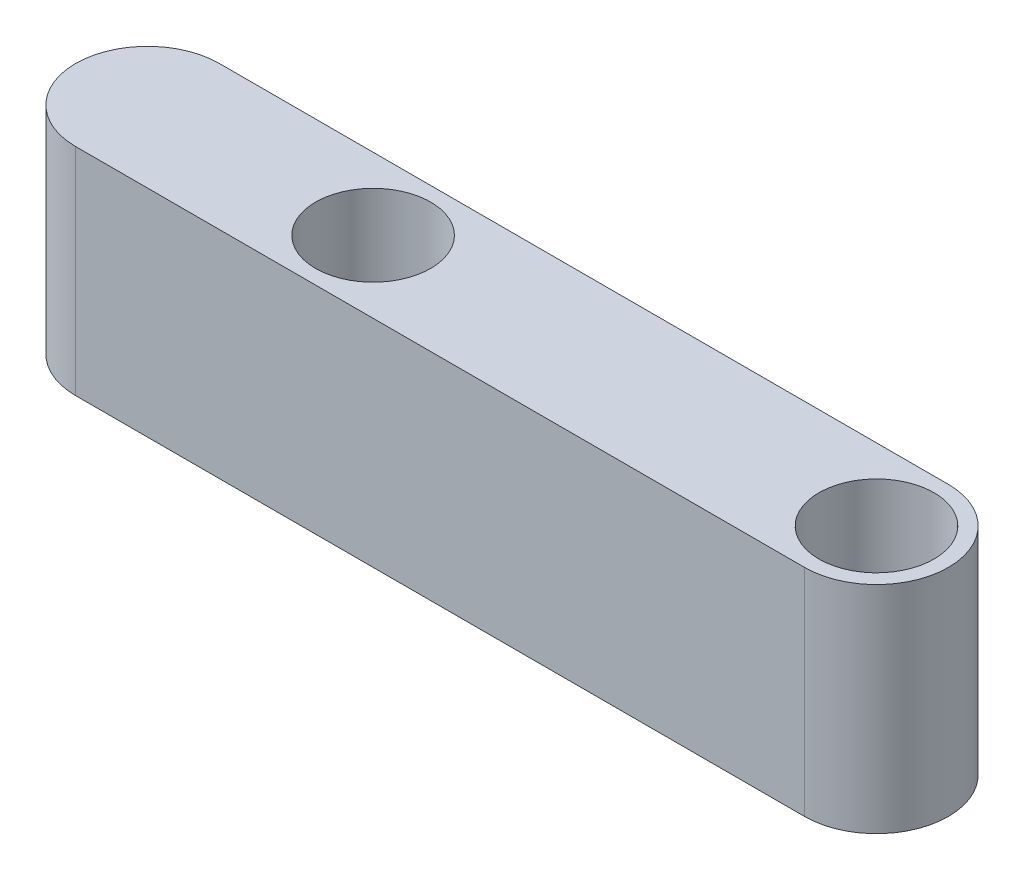
ISO-10303-21;
HEADER;
FILE_DESCRIPTION(('STEP AP214'),'2;1');
FILE_NAME('part.step','',(''),(''),'','','');
FILE_SCHEMA(('AUTOMOTIVE_DESIGN { 1 0 10303 214 1 1 1 1 }'));
ENDSEC;
DATA;
#1=APPLICATION_CONTEXT('core data for automotive mechanical design processes');
#2=APPLICATION_PROTOCOL_DEFINITION('international standard','automotive_design',2000,#1);
#3=PRODUCT_CONTEXT('',#1,'mechanical');
#4=PRODUCT('Part','Part','',(#3));
#5=PRODUCT_RELATED_PRODUCT_CATEGORY('part','',(#4));
#6=PRODUCT_DEFINITION_FORMATION('','',#4);
#7=PRODUCT_DEFINITION_CONTEXT('part definition',#1,'design');
#8=PRODUCT_DEFINITION('design','',#6,#7);
#9=PRODUCT_DEFINITION_SHAPE('','',#8);
#10=(LENGTH_UNIT() NAMED_UNIT(*) SI_UNIT(.MILLI.,.METRE.));
#11=(NAMED_UNIT(*) PLANE_ANGLE_UNIT() SI_UNIT($,.RADIAN.));
#12=(NAMED_UNIT(*) SI_UNIT($,.STERADIAN.) SOLID_ANGLE_UNIT());
#13=UNCERTAINTY_MEASURE_WITH_UNIT(LENGTH_MEASURE(1.E-05),#10,'distance_accuracy_value','');
#14=(GEOMETRIC_REPRESENTATION_CONTEXT(3) GLOBAL_UNCERTAINTY_ASSIGNED_CONTEXT((#13)) GLOBAL_UNIT_ASSIGNED_CONTEXT((#10,
#11,#12)) REPRESENTATION_CONTEXT('',''));
#15=CARTESIAN_POINT('',(0.,0.,0.));
#16=DIRECTION('',(0.,0.,1.));
#17=DIRECTION('',(1.,0.,0.));
#18=AXIS2_PLACEMENT_3D('',#15,#16,#17);
#19=CARTESIAN_POINT('',(0.,1.5,-31.7620802999206));
#20=DIRECTION('',(0.,0.,-1.));
#21=DIRECTION('',(-1.,0.,0.));
#22=AXIS2_PLACEMENT_3D('',#19,#20,#21);
#23=PLANE('',#22);
#24=DIRECTION('',(1.,0.,0.));
#25=VECTOR('',#24,1.);
#26=CARTESIAN_POINT('',(0.,0.,-31.7620802999206));
#27=LINE('',#26,#25);
#28=CARTESIAN_POINT('',(-48.5303285700837,0.,-31.7620802999206));
#29=VERTEX_POINT('',#28);
#30=CARTESIAN_POINT('',(-43.4616429647675,0.,-31.7620802999206));
#31=VERTEX_POINT('',#30);
#32=EDGE_CURVE('E110',#29,#31,#27,.T.);
#33=ORIENTED_EDGE('',*,*,#32,.T.);
#34=DIRECTION('',(0.,-1.,0.));
#35=VECTOR('',#34,1.);
#36=CARTESIAN_POINT('',(-43.4616429647675,1.5,-31.7620802999206));
#37=LINE('',#36,#35);
#38=CARTESIAN_POINT('',(-43.4616429647675,1.5,-31.7620802999206));
#39=VERTEX_POINT('',#38);
#40=EDGE_CURVE('E12',#39,#31,#37,.T.);
#41=ORIENTED_EDGE('',*,*,#40,.F.);
#42=DIRECTION('',(1.,0.,0.));
#43=VECTOR('',#42,1.);
#44=CARTESIAN_POINT('',(0.,1.5,-31.7620802999206));
#45=LINE('',#44,#43);
#46=CARTESIAN_POINT('',(-48.5303285700837,1.5,-31.7620802999206));
#47=VERTEX_POINT('',#46);
#48=EDGE_CURVE('E123',#47,#39,#45,.T.);
#49=ORIENTED_EDGE('',*,*,#48,.F.);
#50=DIRECTION('',(0.,-1.,0.));
#51=VECTOR('',#50,1.);
#52=CARTESIAN_POINT('',(-48.5303285700837,1.5,-31.7620802999206));
#53=LINE('',#52,#51);
#54=EDGE_CURVE('E122',#47,#29,#53,.T.);
#55=ORIENTED_EDGE('',*,*,#54,.T.);
#56=EDGE_LOOP('',(#33,#41,#49,#55));
#57=FACE_BOUND('',#56,.T.);
#58=ADVANCED_FACE('F65',(#57),#23,.F.);
#59=CARTESIAN_POINT('',(-43.4616429647675,1.5,-32.2620802999206));
#60=DIRECTION('',(0.,-1.,0.));
#61=DIRECTION('',(0.,0.,-1.));
#62=AXIS2_PLACEMENT_3D('',#59,#60,#61);
#63=CYLINDRICAL_SURFACE('',#62,0.5);
#64=CARTESIAN_POINT('',(-43.4616429647675,0.,-32.2620802999206));
#65=DIRECTION('',(0.,1.,0.));
#66=DIRECTION('',(0.,0.,1.));
#67=AXIS2_PLACEMENT_3D('',#64,#65,#66);
#68=CIRCLE('',#67,0.5);
#69=CARTESIAN_POINT('',(-43.4616429647675,0.,-32.7620802999206));
#70=VERTEX_POINT('',#69);
#71=EDGE_CURVE('E116',#31,#70,#68,.T.);
#72=ORIENTED_EDGE('',*,*,#71,.T.);
#73=DIRECTION('',(0.,-1.,0.));
#74=VECTOR('',#73,1.);
#75=CARTESIAN_POINT('',(-43.4616429647675,1.5,-32.7620802999206));
#76=LINE('',#75,#74);
#77=CARTESIAN_POINT('',(-43.4616429647675,1.5,-32.7620802999206));
#78=VERTEX_POINT('',#77);
#79=EDGE_CURVE('E76',#78,#70,#76,.T.);
#80=ORIENTED_EDGE('',*,*,#79,.F.);
#81=CARTESIAN_POINT('',(-43.4616429647675,1.5,-32.2620802999206));
#82=DIRECTION('',(0.,1.,0.));
#83=DIRECTION('',(0.,0.,1.));
#84=AXIS2_PLACEMENT_3D('',#81,#82,#83);
#85=CIRCLE('',#84,0.5);
#86=EDGE_CURVE('E85',#39,#78,#85,.T.);
#87=ORIENTED_EDGE('',*,*,#86,.F.);
#88=ORIENTED_EDGE('',*,*,#40,.T.);
#89=EDGE_LOOP('',(#72,#80,#87,#88));
#90=FACE_BOUND('',#89,.T.);
#91=ADVANCED_FACE('F177',(#90),#63,.T.);
#92=CARTESIAN_POINT('',(0.,1.5,-32.7620802999206));
#93=DIRECTION('',(0.,0.,-1.));
#94=DIRECTION('',(-1.,0.,0.));
#95=AXIS2_PLACEMENT_3D('',#92,#93,#94);
#96=PLANE('',#95);
#97=DIRECTION('',(1.,0.,0.));
#98=VECTOR('',#97,1.);
#99=CARTESIAN_POINT('',(0.,0.,-32.7620802999206));
#100=LINE('',#99,#98);
#101=CARTESIAN_POINT('',(-48.5303285700837,0.,-32.7620802999206));
#102=VERTEX_POINT('',#101);
#103=EDGE_CURVE('E104',#102,#70,#100,.T.);
#104=ORIENTED_EDGE('',*,*,#103,.F.);
#105=DIRECTION('',(0.,-1.,0.));
#106=VECTOR('',#105,1.);
#107=CARTESIAN_POINT('',(-48.5303285700837,1.5,-32.7620802999206));
#108=LINE('',#107,#106);
#109=CARTESIAN_POINT('',(-48.5303285700837,1.5,-32.7620802999206));
#110=VERTEX_POINT('',#109);
#111=EDGE_CURVE('E69',#110,#102,#108,.T.);
#112=ORIENTED_EDGE('',*,*,#111,.F.);
#113=DIRECTION('',(1.,0.,0.));
#114=VECTOR('',#113,1.);
#115=CARTESIAN_POINT('',(0.,1.5,-32.7620802999206));
#116=LINE('',#115,#114);
#117=EDGE_CURVE('E153',#110,#78,#116,.T.);
#118=ORIENTED_EDGE('',*,*,#117,.T.);
#119=ORIENTED_EDGE('',*,*,#79,.T.);
#120=EDGE_LOOP('',(#104,#112,#118,#119));
#121=FACE_BOUND('',#120,.T.);
#122=ADVANCED_FACE('F173',(#121),#96,.T.);
#123=CARTESIAN_POINT('',(-43.4616429647675,1.5,-32.2620802999206));
#124=DIRECTION('',(0.,-1.,0.));
#125=DIRECTION('',(0.,0.,-1.));
#126=AXIS2_PLACEMENT_3D('',#123,#124,#125);
#127=CYLINDRICAL_SURFACE('',#126,0.399999999999997);
#128=CARTESIAN_POINT('',(-43.4616429647675,1.5,-32.2620802999206));
#129=DIRECTION('',(0.,1.,0.));
#130=DIRECTION('',(0.,0.,1.));
#131=AXIS2_PLACEMENT_3D('',#128,#129,#130);
#132=CIRCLE('',#131,0.399999999999997);
#133=CARTESIAN_POINT('',(-43.4616429647675,1.5,-31.8620802999206));
#134=VERTEX_POINT('',#133);
#135=EDGE_CURVE('E157',#134,#134,#132,.T.);
#136=ORIENTED_EDGE('',*,*,#135,.T.);
#137=EDGE_LOOP('',(#136));
#138=FACE_BOUND('',#137,.T.);
#139=CARTESIAN_POINT('',(-43.4616429647675,0.,-32.2620802999206));
#140=DIRECTION('',(0.,1.,0.));
#141=DIRECTION('',(0.,0.,1.));
#142=AXIS2_PLACEMENT_3D('',#139,#140,#141);
#143=CIRCLE('',#142,0.399999999999997);
#144=CARTESIAN_POINT('',(-43.4616429647675,0.,-31.8620802999206));
#145=VERTEX_POINT('',#144);
#146=EDGE_CURVE('E141',#145,#145,#143,.T.);
#147=ORIENTED_EDGE('',*,*,#146,.F.);
#148=EDGE_LOOP('',(#147));
#149=FACE_BOUND('',#148,.T.);
#150=ADVANCED_FACE('F176',(#138,#149),#127,.F.);
#151=CARTESIAN_POINT('',(-46.9616429647675,1.5,-32.2620802999206));
#152=DIRECTION('',(0.,-1.,0.));
#153=DIRECTION('',(0.,0.,-1.));
#154=AXIS2_PLACEMENT_3D('',#151,#152,#153);
#155=CYLINDRICAL_SURFACE('',#154,0.399999999999997);
#156=CARTESIAN_POINT('',(-46.9616429647675,1.5,-32.2620802999206));
#157=DIRECTION('',(0.,1.,0.));
#158=DIRECTION('',(0.,0.,1.));
#159=AXIS2_PLACEMENT_3D('',#156,#157,#158);
#160=CIRCLE('',#159,0.399999999999997);
#161=CARTESIAN_POINT('',(-46.9616429647675,1.5,-31.8620802999206));
#162=VERTEX_POINT('',#161);
#163=EDGE_CURVE('E137',#162,#162,#160,.T.);
#164=ORIENTED_EDGE('',*,*,#163,.T.);
#165=EDGE_LOOP('',(#164));
#166=FACE_BOUND('',#165,.T.);
#167=CARTESIAN_POINT('',(-46.9616429647675,0.,-32.2620802999206));
#168=DIRECTION('',(0.,1.,0.));
#169=DIRECTION('',(0.,0.,1.));
#170=AXIS2_PLACEMENT_3D('',#167,#168,#169);
#171=CIRCLE('',#170,0.399999999999997);
#172=CARTESIAN_POINT('',(-46.9616429647675,0.,-31.8620802999206));
#173=VERTEX_POINT('',#172);
#174=EDGE_CURVE('E145',#173,#173,#171,.T.);
#175=ORIENTED_EDGE('',*,*,#174,.F.);
#176=EDGE_LOOP('',(#175));
#177=FACE_BOUND('',#176,.T.);
#178=ADVANCED_FACE('F165',(#166,#177),#155,.F.);
#179=CARTESIAN_POINT('',(0.,0.,0.));
#180=DIRECTION('',(0.,1.,0.));
#181=DIRECTION('',(0.,0.,1.));
#182=AXIS2_PLACEMENT_3D('',#179,#180,#181);
#183=PLANE('',#182);
#184=ORIENTED_EDGE('',*,*,#174,.T.);
#185=EDGE_LOOP('',(#184));
#186=FACE_BOUND('',#185,.T.);
#187=ORIENTED_EDGE('',*,*,#146,.T.);
#188=EDGE_LOOP('',(#187));
#189=FACE_BOUND('',#188,.T.);
#190=ORIENTED_EDGE('',*,*,#103,.T.);
#191=ORIENTED_EDGE('',*,*,#71,.F.);
#192=ORIENTED_EDGE('',*,*,#32,.F.);
#193=CARTESIAN_POINT('',(-48.5303285700837,0.,-32.2620802999206));
#194=DIRECTION('',(0.,1.,0.));
#195=DIRECTION('',(0.,0.,1.));
#196=AXIS2_PLACEMENT_3D('',#193,#194,#195);
#197=CIRCLE('',#196,0.5);
#198=EDGE_CURVE('E114',#102,#29,#197,.T.);
#199=ORIENTED_EDGE('',*,*,#198,.F.);
#200=EDGE_LOOP('',(#190,#191,#192,#199));
#201=FACE_BOUND('',#200,.T.);
#202=ADVANCED_FACE('F112',(#186,#189,#201),#183,.F.);
#203=CARTESIAN_POINT('',(0.,1.5,0.));
#204=DIRECTION('',(0.,1.,0.));
#205=DIRECTION('',(0.,0.,1.));
#206=AXIS2_PLACEMENT_3D('',#203,#204,#205);
#207=PLANE('',#206);
#208=ORIENTED_EDGE('',*,*,#163,.F.);
#209=EDGE_LOOP('',(#208));
#210=FACE_BOUND('',#209,.T.);
#211=ORIENTED_EDGE('',*,*,#135,.F.);
#212=EDGE_LOOP('',(#211));
#213=FACE_BOUND('',#212,.T.);
#214=ORIENTED_EDGE('',*,*,#117,.F.);
#215=CARTESIAN_POINT('',(-48.5303285700837,1.5,-32.2620802999206));
#216=DIRECTION('',(0.,1.,0.));
#217=DIRECTION('',(0.,0.,1.));
#218=AXIS2_PLACEMENT_3D('',#215,#216,#217);
#219=CIRCLE('',#218,0.5);
#220=EDGE_CURVE('E128',#110,#47,#219,.T.);
#221=ORIENTED_EDGE('',*,*,#220,.T.);
#222=ORIENTED_EDGE('',*,*,#48,.T.);
#223=ORIENTED_EDGE('',*,*,#86,.T.);
#224=EDGE_LOOP('',(#214,#221,#222,#223));
#225=FACE_BOUND('',#224,.T.);
#226=ADVANCED_FACE('F168',(#210,#213,#225),#207,.T.);
#227=CARTESIAN_POINT('',(-48.5303285700837,1.5,-32.2620802999206));
#228=DIRECTION('',(0.,-1.,0.));
#229=DIRECTION('',(0.,0.,-1.));
#230=AXIS2_PLACEMENT_3D('',#227,#228,#229);
#231=CYLINDRICAL_SURFACE('',#230,0.5);
#232=ORIENTED_EDGE('',*,*,#198,.T.);
#233=ORIENTED_EDGE('',*,*,#54,.F.);
#234=ORIENTED_EDGE('',*,*,#220,.F.);
#235=ORIENTED_EDGE('',*,*,#111,.T.);
#236=EDGE_LOOP('',(#232,#233,#234,#235));
#237=FACE_BOUND('',#236,.T.);
#238=ADVANCED_FACE('F67',(#237),#231,.T.);
#239=CLOSED_SHELL('',(#58,#91,#122,#150,#178,#202,#226,#238));
#240=MANIFOLD_SOLID_BREP('B2',#239);
#241=ADVANCED_BREP_SHAPE_REPRESENTATION('',(#18,#240),#14);
#242=SHAPE_DEFINITION_REPRESENTATION(#9,#241);
ENDSEC;
END-ISO-10303-21;
